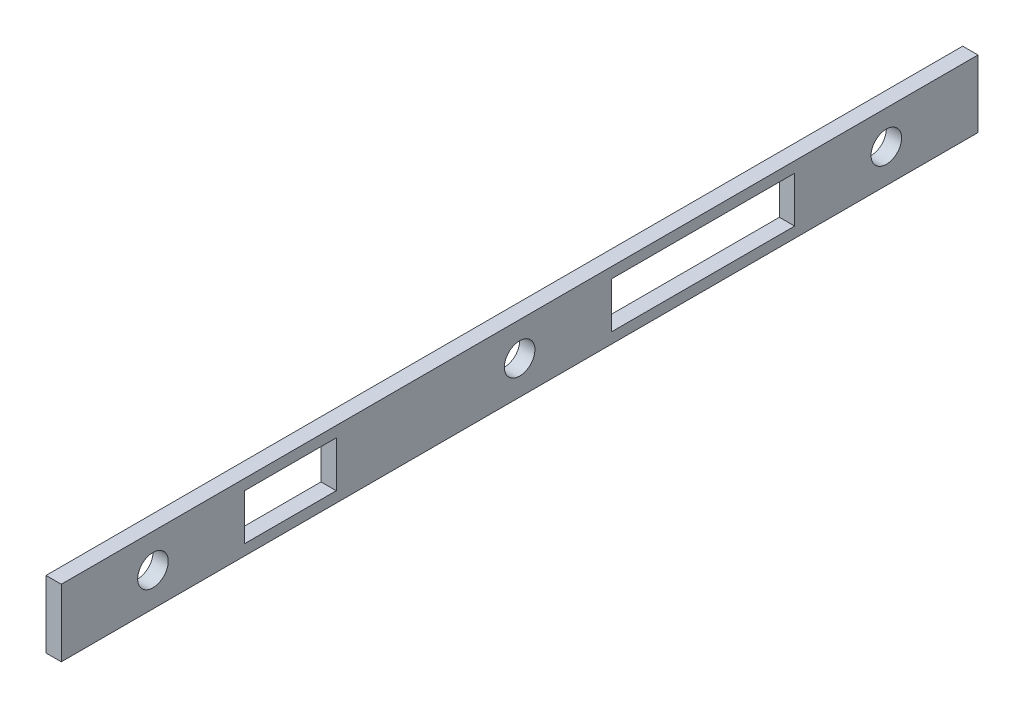
ISO-10303-21;
HEADER;
FILE_DESCRIPTION(('STEP AP214'),'2;1');
FILE_NAME('part.step','',(''),(''),'','','');
FILE_SCHEMA(('AUTOMOTIVE_DESIGN { 1 0 10303 214 1 1 1 1 }'));
ENDSEC;
DATA;
#1=APPLICATION_CONTEXT('core data for automotive mechanical design processes');
#2=APPLICATION_PROTOCOL_DEFINITION('international standard','automotive_design',2000,#1);
#3=PRODUCT_CONTEXT('',#1,'mechanical');
#4=PRODUCT('Part','Part','',(#3));
#5=PRODUCT_RELATED_PRODUCT_CATEGORY('part','',(#4));
#6=PRODUCT_DEFINITION_FORMATION('','',#4);
#7=PRODUCT_DEFINITION_CONTEXT('part definition',#1,'design');
#8=PRODUCT_DEFINITION('design','',#6,#7);
#9=PRODUCT_DEFINITION_SHAPE('','',#8);
#10=(LENGTH_UNIT() NAMED_UNIT(*) SI_UNIT(.MILLI.,.METRE.));
#11=(NAMED_UNIT(*) PLANE_ANGLE_UNIT() SI_UNIT($,.RADIAN.));
#12=(NAMED_UNIT(*) SI_UNIT($,.STERADIAN.) SOLID_ANGLE_UNIT());
#13=UNCERTAINTY_MEASURE_WITH_UNIT(LENGTH_MEASURE(1.E-05),#10,'distance_accuracy_value','');
#14=(GEOMETRIC_REPRESENTATION_CONTEXT(3) GLOBAL_UNCERTAINTY_ASSIGNED_CONTEXT((#13)) GLOBAL_UNIT_ASSIGNED_CONTEXT((#10,
#11,#12)) REPRESENTATION_CONTEXT('',''));
#15=CARTESIAN_POINT('',(0.,0.,0.));
#16=DIRECTION('',(0.,0.,1.));
#17=DIRECTION('',(1.,0.,0.));
#18=AXIS2_PLACEMENT_3D('',#15,#16,#17);
#19=CARTESIAN_POINT('',(5.,0.,0.));
#20=DIRECTION('',(0.,0.,-1.));
#21=DIRECTION('',(-1.,0.,0.));
#22=AXIS2_PLACEMENT_3D('',#19,#20,#21);
#23=PLANE('',#22);
#24=DIRECTION('',(0.,-1.,0.));
#25=VECTOR('',#24,1.);
#26=CARTESIAN_POINT('',(0.,0.,0.));
#27=LINE('',#26,#25);
#28=CARTESIAN_POINT('',(0.,22.,0.));
#29=VERTEX_POINT('',#28);
#30=CARTESIAN_POINT('',(0.,0.,0.));
#31=VERTEX_POINT('',#30);
#32=EDGE_CURVE('E255',#29,#31,#27,.T.);
#33=ORIENTED_EDGE('',*,*,#32,.T.);
#34=DIRECTION('',(-1.,0.,0.));
#35=VECTOR('',#34,1.);
#36=CARTESIAN_POINT('',(5.,0.,0.));
#37=LINE('',#36,#35);
#38=CARTESIAN_POINT('',(5.,0.,0.));
#39=VERTEX_POINT('',#38);
#40=EDGE_CURVE('E11',#39,#31,#37,.T.);
#41=ORIENTED_EDGE('',*,*,#40,.F.);
#42=DIRECTION('',(0.,-1.,0.));
#43=VECTOR('',#42,1.);
#44=CARTESIAN_POINT('',(5.,0.,0.));
#45=LINE('',#44,#43);
#46=CARTESIAN_POINT('',(5.,22.,0.));
#47=VERTEX_POINT('',#46);
#48=EDGE_CURVE('E240',#47,#39,#45,.T.);
#49=ORIENTED_EDGE('',*,*,#48,.F.);
#50=DIRECTION('',(-1.,0.,0.));
#51=VECTOR('',#50,1.);
#52=CARTESIAN_POINT('',(5.,22.,0.));
#53=LINE('',#52,#51);
#54=EDGE_CURVE('E254',#47,#29,#53,.T.);
#55=ORIENTED_EDGE('',*,*,#54,.T.);
#56=EDGE_LOOP('',(#33,#41,#49,#55));
#57=FACE_BOUND('',#56,.T.);
#58=ADVANCED_FACE('F39',(#57),#23,.F.);
#59=CARTESIAN_POINT('',(5.,0.,0.));
#60=DIRECTION('',(0.,1.,0.));
#61=DIRECTION('',(0.,0.,1.));
#62=AXIS2_PLACEMENT_3D('',#59,#60,#61);
#63=PLANE('',#62);
#64=DIRECTION('',(0.,0.,-1.));
#65=VECTOR('',#64,1.);
#66=CARTESIAN_POINT('',(0.,0.,0.));
#67=LINE('',#66,#65);
#68=CARTESIAN_POINT('',(0.,0.,-300.));
#69=VERTEX_POINT('',#68);
#70=EDGE_CURVE('E259',#31,#69,#67,.T.);
#71=ORIENTED_EDGE('',*,*,#70,.T.);
#72=DIRECTION('',(-1.,0.,0.));
#73=VECTOR('',#72,1.);
#74=CARTESIAN_POINT('',(5.,0.,-300.));
#75=LINE('',#74,#73);
#76=CARTESIAN_POINT('',(5.,0.,-300.));
#77=VERTEX_POINT('',#76);
#78=EDGE_CURVE('E47',#77,#69,#75,.T.);
#79=ORIENTED_EDGE('',*,*,#78,.F.);
#80=DIRECTION('',(0.,0.,-1.));
#81=VECTOR('',#80,1.);
#82=CARTESIAN_POINT('',(5.,0.,0.));
#83=LINE('',#82,#81);
#84=EDGE_CURVE('E244',#39,#77,#83,.T.);
#85=ORIENTED_EDGE('',*,*,#84,.F.);
#86=ORIENTED_EDGE('',*,*,#40,.T.);
#87=EDGE_LOOP('',(#71,#79,#85,#86));
#88=FACE_BOUND('',#87,.T.);
#89=ADVANCED_FACE('F295',(#88),#63,.F.);
#90=CARTESIAN_POINT('',(5.,0.,-300.));
#91=DIRECTION('',(0.,0.,1.));
#92=DIRECTION('',(1.,0.,0.));
#93=AXIS2_PLACEMENT_3D('',#90,#91,#92);
#94=PLANE('',#93);
#95=DIRECTION('',(0.,1.,0.));
#96=VECTOR('',#95,1.);
#97=CARTESIAN_POINT('',(0.,0.,-300.));
#98=LINE('',#97,#96);
#99=CARTESIAN_POINT('',(0.,22.,-300.));
#100=VERTEX_POINT('',#99);
#101=EDGE_CURVE('E263',#69,#100,#98,.T.);
#102=ORIENTED_EDGE('',*,*,#101,.T.);
#103=DIRECTION('',(-1.,0.,0.));
#104=VECTOR('',#103,1.);
#105=CARTESIAN_POINT('',(5.,22.,-300.));
#106=LINE('',#105,#104);
#107=CARTESIAN_POINT('',(5.,22.,-300.));
#108=VERTEX_POINT('',#107);
#109=EDGE_CURVE('E271',#108,#100,#106,.T.);
#110=ORIENTED_EDGE('',*,*,#109,.F.);
#111=DIRECTION('',(0.,1.,0.));
#112=VECTOR('',#111,1.);
#113=CARTESIAN_POINT('',(5.,0.,-300.));
#114=LINE('',#113,#112);
#115=EDGE_CURVE('E248',#77,#108,#114,.T.);
#116=ORIENTED_EDGE('',*,*,#115,.F.);
#117=ORIENTED_EDGE('',*,*,#78,.T.);
#118=EDGE_LOOP('',(#102,#110,#116,#117));
#119=FACE_BOUND('',#118,.T.);
#120=ADVANCED_FACE('F280',(#119),#94,.F.);
#121=CARTESIAN_POINT('',(5.,22.,0.));
#122=DIRECTION('',(0.,-1.,0.));
#123=DIRECTION('',(0.,0.,-1.));
#124=AXIS2_PLACEMENT_3D('',#121,#122,#123);
#125=PLANE('',#124);
#126=DIRECTION('',(0.,0.,1.));
#127=VECTOR('',#126,1.);
#128=CARTESIAN_POINT('',(0.,22.,0.));
#129=LINE('',#128,#127);
#130=EDGE_CURVE('E245',#100,#29,#129,.T.);
#131=ORIENTED_EDGE('',*,*,#130,.T.);
#132=ORIENTED_EDGE('',*,*,#54,.F.);
#133=DIRECTION('',(0.,0.,1.));
#134=VECTOR('',#133,1.);
#135=CARTESIAN_POINT('',(5.,22.,0.));
#136=LINE('',#135,#134);
#137=EDGE_CURVE('E251',#108,#47,#136,.T.);
#138=ORIENTED_EDGE('',*,*,#137,.F.);
#139=ORIENTED_EDGE('',*,*,#109,.T.);
#140=EDGE_LOOP('',(#131,#132,#138,#139));
#141=FACE_BOUND('',#140,.T.);
#142=ADVANCED_FACE('F288',(#141),#125,.F.);
#143=CARTESIAN_POINT('',(5.,0.,0.));
#144=DIRECTION('',(-1.,0.,0.));
#145=DIRECTION('',(0.,0.,1.));
#146=AXIS2_PLACEMENT_3D('',#143,#144,#145);
#147=PLANE('',#146);
#148=CARTESIAN_POINT('',(5.,11.,-30.));
#149=DIRECTION('',(1.,0.,0.));
#150=DIRECTION('',(0.,0.,-1.));
#151=AXIS2_PLACEMENT_3D('',#148,#149,#150);
#152=CIRCLE('',#151,5.);
#153=CARTESIAN_POINT('',(5.,11.,-35.));
#154=VERTEX_POINT('',#153);
#155=EDGE_CURVE('E159',#154,#154,#152,.T.);
#156=ORIENTED_EDGE('',*,*,#155,.F.);
#157=EDGE_LOOP('',(#156));
#158=FACE_BOUND('',#157,.T.);
#159=DIRECTION('',(0.,0.,-1.));
#160=VECTOR('',#159,1.);
#161=CARTESIAN_POINT('',(5.,3.5,-180.));
#162=LINE('',#161,#160);
#163=CARTESIAN_POINT('',(5.,3.5,-180.));
#164=VERTEX_POINT('',#163);
#165=CARTESIAN_POINT('',(5.,3.5,-240.));
#166=VERTEX_POINT('',#165);
#167=EDGE_CURVE('E204',#164,#166,#162,.T.);
#168=ORIENTED_EDGE('',*,*,#167,.F.);
#169=DIRECTION('',(0.,-1.,0.));
#170=VECTOR('',#169,1.);
#171=CARTESIAN_POINT('',(5.,18.5,-180.));
#172=LINE('',#171,#170);
#173=CARTESIAN_POINT('',(5.,18.5,-180.));
#174=VERTEX_POINT('',#173);
#175=EDGE_CURVE('E54',#174,#164,#172,.T.);
#176=ORIENTED_EDGE('',*,*,#175,.F.);
#177=DIRECTION('',(0.,0.,1.));
#178=VECTOR('',#177,1.);
#179=CARTESIAN_POINT('',(5.,18.5,-180.));
#180=LINE('',#179,#178);
#181=CARTESIAN_POINT('',(5.,18.5,-240.));
#182=VERTEX_POINT('',#181);
#183=EDGE_CURVE('E189',#182,#174,#180,.T.);
#184=ORIENTED_EDGE('',*,*,#183,.F.);
#185=DIRECTION('',(0.,1.,0.));
#186=VECTOR('',#185,1.);
#187=CARTESIAN_POINT('',(5.,18.5,-240.));
#188=LINE('',#187,#186);
#189=EDGE_CURVE('E208',#166,#182,#188,.T.);
#190=ORIENTED_EDGE('',*,*,#189,.F.);
#191=EDGE_LOOP('',(#168,#176,#184,#190));
#192=FACE_BOUND('',#191,.T.);
#193=DIRECTION('',(0.,0.,-1.));
#194=VECTOR('',#193,1.);
#195=CARTESIAN_POINT('',(5.,3.5,-60.));
#196=LINE('',#195,#194);
#197=CARTESIAN_POINT('',(5.,3.5,-60.));
#198=VERTEX_POINT('',#197);
#199=CARTESIAN_POINT('',(5.,3.5,-90.));
#200=VERTEX_POINT('',#199);
#201=EDGE_CURVE('E168',#198,#200,#196,.T.);
#202=ORIENTED_EDGE('',*,*,#201,.F.);
#203=DIRECTION('',(0.,-1.,0.));
#204=VECTOR('',#203,1.);
#205=CARTESIAN_POINT('',(5.,18.5,-60.));
#206=LINE('',#205,#204);
#207=CARTESIAN_POINT('',(5.,18.5,-60.));
#208=VERTEX_POINT('',#207);
#209=EDGE_CURVE('E62',#208,#198,#206,.T.);
#210=ORIENTED_EDGE('',*,*,#209,.F.);
#211=DIRECTION('',(0.,0.,1.));
#212=VECTOR('',#211,1.);
#213=CARTESIAN_POINT('',(5.,18.5,-60.));
#214=LINE('',#213,#212);
#215=CARTESIAN_POINT('',(5.,18.5,-90.));
#216=VERTEX_POINT('',#215);
#217=EDGE_CURVE('E152',#216,#208,#214,.T.);
#218=ORIENTED_EDGE('',*,*,#217,.F.);
#219=DIRECTION('',(0.,1.,0.));
#220=VECTOR('',#219,1.);
#221=CARTESIAN_POINT('',(5.,18.5,-90.));
#222=LINE('',#221,#220);
#223=EDGE_CURVE('E156',#200,#216,#222,.T.);
#224=ORIENTED_EDGE('',*,*,#223,.F.);
#225=EDGE_LOOP('',(#202,#210,#218,#224));
#226=FACE_BOUND('',#225,.T.);
#227=CARTESIAN_POINT('',(5.,11.,-270.));
#228=DIRECTION('',(1.,0.,0.));
#229=DIRECTION('',(0.,0.,-1.));
#230=AXIS2_PLACEMENT_3D('',#227,#228,#229);
#231=CIRCLE('',#230,4.99999999999999);
#232=CARTESIAN_POINT('',(5.,11.,-275.));
#233=VERTEX_POINT('',#232);
#234=EDGE_CURVE('E178',#233,#233,#231,.T.);
#235=ORIENTED_EDGE('',*,*,#234,.F.);
#236=EDGE_LOOP('',(#235));
#237=FACE_BOUND('',#236,.T.);
#238=CARTESIAN_POINT('',(5.,11.,-150.));
#239=DIRECTION('',(1.,0.,0.));
#240=DIRECTION('',(0.,0.,-1.));
#241=AXIS2_PLACEMENT_3D('',#238,#239,#240);
#242=CIRCLE('',#241,4.99999999999999);
#243=CARTESIAN_POINT('',(5.,11.,-155.));
#244=VERTEX_POINT('',#243);
#245=EDGE_CURVE('E229',#244,#244,#242,.T.);
#246=ORIENTED_EDGE('',*,*,#245,.F.);
#247=EDGE_LOOP('',(#246));
#248=FACE_BOUND('',#247,.T.);
#249=ORIENTED_EDGE('',*,*,#48,.T.);
#250=ORIENTED_EDGE('',*,*,#84,.T.);
#251=ORIENTED_EDGE('',*,*,#115,.T.);
#252=ORIENTED_EDGE('',*,*,#137,.T.);
#253=EDGE_LOOP('',(#249,#250,#251,#252));
#254=FACE_BOUND('',#253,.T.);
#255=ADVANCED_FACE('F294',(#158,#192,#226,#237,#248,#254),#147,.F.);
#256=CARTESIAN_POINT('',(0.,0.,0.));
#257=DIRECTION('',(-1.,0.,0.));
#258=DIRECTION('',(0.,0.,1.));
#259=AXIS2_PLACEMENT_3D('',#256,#257,#258);
#260=PLANE('',#259);
#261=CARTESIAN_POINT('',(0.,11.,-30.));
#262=DIRECTION('',(1.,0.,0.));
#263=DIRECTION('',(0.,0.,-1.));
#264=AXIS2_PLACEMENT_3D('',#261,#262,#263);
#265=CIRCLE('',#264,5.);
#266=CARTESIAN_POINT('',(0.,11.,-35.));
#267=VERTEX_POINT('',#266);
#268=EDGE_CURVE('E260',#267,#267,#265,.T.);
#269=ORIENTED_EDGE('',*,*,#268,.T.);
#270=EDGE_LOOP('',(#269));
#271=FACE_BOUND('',#270,.T.);
#272=DIRECTION('',(0.,-1.,0.));
#273=VECTOR('',#272,1.);
#274=CARTESIAN_POINT('',(0.,18.5,-180.));
#275=LINE('',#274,#273);
#276=CARTESIAN_POINT('',(0.,18.5,-180.));
#277=VERTEX_POINT('',#276);
#278=CARTESIAN_POINT('',(0.,3.5,-180.));
#279=VERTEX_POINT('',#278);
#280=EDGE_CURVE('E184',#277,#279,#275,.T.);
#281=ORIENTED_EDGE('',*,*,#280,.T.);
#282=DIRECTION('',(0.,0.,-1.));
#283=VECTOR('',#282,1.);
#284=CARTESIAN_POINT('',(0.,3.5,-180.));
#285=LINE('',#284,#283);
#286=CARTESIAN_POINT('',(0.,3.5,-240.));
#287=VERTEX_POINT('',#286);
#288=EDGE_CURVE('E188',#279,#287,#285,.T.);
#289=ORIENTED_EDGE('',*,*,#288,.T.);
#290=DIRECTION('',(0.,1.,0.));
#291=VECTOR('',#290,1.);
#292=CARTESIAN_POINT('',(0.,18.5,-240.));
#293=LINE('',#292,#291);
#294=CARTESIAN_POINT('',(0.,18.5,-240.));
#295=VERTEX_POINT('',#294);
#296=EDGE_CURVE('E193',#287,#295,#293,.T.);
#297=ORIENTED_EDGE('',*,*,#296,.T.);
#298=DIRECTION('',(0.,0.,1.));
#299=VECTOR('',#298,1.);
#300=CARTESIAN_POINT('',(0.,18.5,-180.));
#301=LINE('',#300,#299);
#302=EDGE_CURVE('E197',#295,#277,#301,.T.);
#303=ORIENTED_EDGE('',*,*,#302,.T.);
#304=EDGE_LOOP('',(#281,#289,#297,#303));
#305=FACE_BOUND('',#304,.T.);
#306=DIRECTION('',(0.,-1.,0.));
#307=VECTOR('',#306,1.);
#308=CARTESIAN_POINT('',(0.,18.5,-60.));
#309=LINE('',#308,#307);
#310=CARTESIAN_POINT('',(0.,18.5,-60.));
#311=VERTEX_POINT('',#310);
#312=CARTESIAN_POINT('',(0.,3.5,-60.));
#313=VERTEX_POINT('',#312);
#314=EDGE_CURVE('E130',#311,#313,#309,.T.);
#315=ORIENTED_EDGE('',*,*,#314,.T.);
#316=DIRECTION('',(0.,0.,-1.));
#317=VECTOR('',#316,1.);
#318=CARTESIAN_POINT('',(0.,3.5,-60.));
#319=LINE('',#318,#317);
#320=CARTESIAN_POINT('',(0.,3.5,-90.));
#321=VERTEX_POINT('',#320);
#322=EDGE_CURVE('E141',#313,#321,#319,.T.);
#323=ORIENTED_EDGE('',*,*,#322,.T.);
#324=DIRECTION('',(0.,1.,0.));
#325=VECTOR('',#324,1.);
#326=CARTESIAN_POINT('',(0.,18.5,-90.));
#327=LINE('',#326,#325);
#328=CARTESIAN_POINT('',(0.,18.5,-90.));
#329=VERTEX_POINT('',#328);
#330=EDGE_CURVE('E146',#321,#329,#327,.T.);
#331=ORIENTED_EDGE('',*,*,#330,.T.);
#332=DIRECTION('',(0.,0.,1.));
#333=VECTOR('',#332,1.);
#334=CARTESIAN_POINT('',(0.,18.5,-60.));
#335=LINE('',#334,#333);
#336=EDGE_CURVE('E137',#329,#311,#335,.T.);
#337=ORIENTED_EDGE('',*,*,#336,.T.);
#338=EDGE_LOOP('',(#315,#323,#331,#337));
#339=FACE_BOUND('',#338,.T.);
#340=CARTESIAN_POINT('',(0.,11.,-270.));
#341=DIRECTION('',(1.,0.,0.));
#342=DIRECTION('',(0.,0.,-1.));
#343=AXIS2_PLACEMENT_3D('',#340,#341,#342);
#344=CIRCLE('',#343,4.99999999999999);
#345=CARTESIAN_POINT('',(0.,11.,-275.));
#346=VERTEX_POINT('',#345);
#347=EDGE_CURVE('E233',#346,#346,#344,.T.);
#348=ORIENTED_EDGE('',*,*,#347,.T.);
#349=EDGE_LOOP('',(#348));
#350=FACE_BOUND('',#349,.T.);
#351=CARTESIAN_POINT('',(0.,11.,-150.));
#352=DIRECTION('',(1.,0.,0.));
#353=DIRECTION('',(0.,0.,-1.));
#354=AXIS2_PLACEMENT_3D('',#351,#352,#353);
#355=CIRCLE('',#354,4.99999999999999);
#356=CARTESIAN_POINT('',(0.,11.,-155.));
#357=VERTEX_POINT('',#356);
#358=EDGE_CURVE('E225',#357,#357,#355,.T.);
#359=ORIENTED_EDGE('',*,*,#358,.T.);
#360=EDGE_LOOP('',(#359));
#361=FACE_BOUND('',#360,.T.);
#362=ORIENTED_EDGE('',*,*,#32,.F.);
#363=ORIENTED_EDGE('',*,*,#130,.F.);
#364=ORIENTED_EDGE('',*,*,#101,.F.);
#365=ORIENTED_EDGE('',*,*,#70,.F.);
#366=EDGE_LOOP('',(#362,#363,#364,#365));
#367=FACE_BOUND('',#366,.T.);
#368=ADVANCED_FACE('F148',(#271,#305,#339,#350,#361,#367),#260,.T.);
#369=CARTESIAN_POINT('',(0.,11.,-150.));
#370=DIRECTION('',(1.,0.,0.));
#371=DIRECTION('',(0.,0.,-1.));
#372=AXIS2_PLACEMENT_3D('',#369,#370,#371);
#373=CYLINDRICAL_SURFACE('',#372,4.99999999999999);
#374=ORIENTED_EDGE('',*,*,#358,.F.);
#375=EDGE_LOOP('',(#374));
#376=FACE_BOUND('',#375,.T.);
#377=ORIENTED_EDGE('',*,*,#245,.T.);
#378=EDGE_LOOP('',(#377));
#379=FACE_BOUND('',#378,.T.);
#380=ADVANCED_FACE('F307',(#376,#379),#373,.F.);
#381=CARTESIAN_POINT('',(0.,11.,-270.));
#382=DIRECTION('',(1.,0.,0.));
#383=DIRECTION('',(0.,0.,-1.));
#384=AXIS2_PLACEMENT_3D('',#381,#382,#383);
#385=CYLINDRICAL_SURFACE('',#384,4.99999999999999);
#386=ORIENTED_EDGE('',*,*,#347,.F.);
#387=EDGE_LOOP('',(#386));
#388=FACE_BOUND('',#387,.T.);
#389=ORIENTED_EDGE('',*,*,#234,.T.);
#390=EDGE_LOOP('',(#389));
#391=FACE_BOUND('',#390,.T.);
#392=ADVANCED_FACE('F312',(#388,#391),#385,.F.);
#393=CARTESIAN_POINT('',(0.,18.5,-60.));
#394=DIRECTION('',(0.,0.,1.));
#395=DIRECTION('',(1.,0.,0.));
#396=AXIS2_PLACEMENT_3D('',#393,#394,#395);
#397=PLANE('',#396);
#398=ORIENTED_EDGE('',*,*,#209,.T.);
#399=DIRECTION('',(1.,0.,0.));
#400=VECTOR('',#399,1.);
#401=CARTESIAN_POINT('',(0.,3.5,-60.));
#402=LINE('',#401,#400);
#403=EDGE_CURVE('E126',#313,#198,#402,.T.);
#404=ORIENTED_EDGE('',*,*,#403,.F.);
#405=ORIENTED_EDGE('',*,*,#314,.F.);
#406=DIRECTION('',(1.,0.,0.));
#407=VECTOR('',#406,1.);
#408=CARTESIAN_POINT('',(0.,18.5,-60.));
#409=LINE('',#408,#407);
#410=EDGE_CURVE('E175',#311,#208,#409,.T.);
#411=ORIENTED_EDGE('',*,*,#410,.T.);
#412=EDGE_LOOP('',(#398,#404,#405,#411));
#413=FACE_BOUND('',#412,.T.);
#414=ADVANCED_FACE('F128',(#413),#397,.F.);
#415=CARTESIAN_POINT('',(0.,18.5,-60.));
#416=DIRECTION('',(0.,1.,0.));
#417=DIRECTION('',(0.,0.,1.));
#418=AXIS2_PLACEMENT_3D('',#415,#416,#417);
#419=PLANE('',#418);
#420=ORIENTED_EDGE('',*,*,#217,.T.);
#421=ORIENTED_EDGE('',*,*,#410,.F.);
#422=ORIENTED_EDGE('',*,*,#336,.F.);
#423=DIRECTION('',(1.,0.,0.));
#424=VECTOR('',#423,1.);
#425=CARTESIAN_POINT('',(0.,18.5,-90.));
#426=LINE('',#425,#424);
#427=EDGE_CURVE('E179',#329,#216,#426,.T.);
#428=ORIENTED_EDGE('',*,*,#427,.T.);
#429=EDGE_LOOP('',(#420,#421,#422,#428));
#430=FACE_BOUND('',#429,.T.);
#431=ADVANCED_FACE('F337',(#430),#419,.F.);
#432=CARTESIAN_POINT('',(0.,18.5,-90.));
#433=DIRECTION('',(0.,0.,-1.));
#434=DIRECTION('',(-1.,0.,0.));
#435=AXIS2_PLACEMENT_3D('',#432,#433,#434);
#436=PLANE('',#435);
#437=ORIENTED_EDGE('',*,*,#223,.T.);
#438=ORIENTED_EDGE('',*,*,#427,.F.);
#439=ORIENTED_EDGE('',*,*,#330,.F.);
#440=DIRECTION('',(1.,0.,0.));
#441=VECTOR('',#440,1.);
#442=CARTESIAN_POINT('',(0.,3.5,-90.));
#443=LINE('',#442,#441);
#444=EDGE_CURVE('E136',#321,#200,#443,.T.);
#445=ORIENTED_EDGE('',*,*,#444,.T.);
#446=EDGE_LOOP('',(#437,#438,#439,#445));
#447=FACE_BOUND('',#446,.T.);
#448=ADVANCED_FACE('F340',(#447),#436,.F.);
#449=CARTESIAN_POINT('',(0.,3.5,-60.));
#450=DIRECTION('',(0.,-1.,0.));
#451=DIRECTION('',(0.,0.,-1.));
#452=AXIS2_PLACEMENT_3D('',#449,#450,#451);
#453=PLANE('',#452);
#454=ORIENTED_EDGE('',*,*,#201,.T.);
#455=ORIENTED_EDGE('',*,*,#444,.F.);
#456=ORIENTED_EDGE('',*,*,#322,.F.);
#457=ORIENTED_EDGE('',*,*,#403,.T.);
#458=EDGE_LOOP('',(#454,#455,#456,#457));
#459=FACE_BOUND('',#458,.T.);
#460=ADVANCED_FACE('F142',(#459),#453,.F.);
#461=CARTESIAN_POINT('',(0.,18.5,-180.));
#462=DIRECTION('',(0.,0.,1.));
#463=DIRECTION('',(1.,0.,0.));
#464=AXIS2_PLACEMENT_3D('',#461,#462,#463);
#465=PLANE('',#464);
#466=ORIENTED_EDGE('',*,*,#175,.T.);
#467=DIRECTION('',(1.,0.,0.));
#468=VECTOR('',#467,1.);
#469=CARTESIAN_POINT('',(0.,3.5,-180.));
#470=LINE('',#469,#468);
#471=EDGE_CURVE('E201',#279,#164,#470,.T.);
#472=ORIENTED_EDGE('',*,*,#471,.F.);
#473=ORIENTED_EDGE('',*,*,#280,.F.);
#474=DIRECTION('',(1.,0.,0.));
#475=VECTOR('',#474,1.);
#476=CARTESIAN_POINT('',(0.,18.5,-180.));
#477=LINE('',#476,#475);
#478=EDGE_CURVE('E169',#277,#174,#477,.T.);
#479=ORIENTED_EDGE('',*,*,#478,.T.);
#480=EDGE_LOOP('',(#466,#472,#473,#479));
#481=FACE_BOUND('',#480,.T.);
#482=ADVANCED_FACE('F319',(#481),#465,.F.);
#483=CARTESIAN_POINT('',(0.,18.5,-180.));
#484=DIRECTION('',(0.,1.,0.));
#485=DIRECTION('',(0.,0.,1.));
#486=AXIS2_PLACEMENT_3D('',#483,#484,#485);
#487=PLANE('',#486);
#488=ORIENTED_EDGE('',*,*,#183,.T.);
#489=ORIENTED_EDGE('',*,*,#478,.F.);
#490=ORIENTED_EDGE('',*,*,#302,.F.);
#491=DIRECTION('',(1.,0.,0.));
#492=VECTOR('',#491,1.);
#493=CARTESIAN_POINT('',(0.,18.5,-240.));
#494=LINE('',#493,#492);
#495=EDGE_CURVE('E217',#295,#182,#494,.T.);
#496=ORIENTED_EDGE('',*,*,#495,.T.);
#497=EDGE_LOOP('',(#488,#489,#490,#496));
#498=FACE_BOUND('',#497,.T.);
#499=ADVANCED_FACE('F322',(#498),#487,.F.);
#500=CARTESIAN_POINT('',(0.,18.5,-240.));
#501=DIRECTION('',(0.,0.,-1.));
#502=DIRECTION('',(-1.,0.,0.));
#503=AXIS2_PLACEMENT_3D('',#500,#501,#502);
#504=PLANE('',#503);
#505=ORIENTED_EDGE('',*,*,#189,.T.);
#506=ORIENTED_EDGE('',*,*,#495,.F.);
#507=ORIENTED_EDGE('',*,*,#296,.F.);
#508=DIRECTION('',(1.,0.,0.));
#509=VECTOR('',#508,1.);
#510=CARTESIAN_POINT('',(0.,3.5,-240.));
#511=LINE('',#510,#509);
#512=EDGE_CURVE('E220',#287,#166,#511,.T.);
#513=ORIENTED_EDGE('',*,*,#512,.T.);
#514=EDGE_LOOP('',(#505,#506,#507,#513));
#515=FACE_BOUND('',#514,.T.);
#516=ADVANCED_FACE('F327',(#515),#504,.F.);
#517=CARTESIAN_POINT('',(0.,3.5,-180.));
#518=DIRECTION('',(0.,-1.,0.));
#519=DIRECTION('',(0.,0.,-1.));
#520=AXIS2_PLACEMENT_3D('',#517,#518,#519);
#521=PLANE('',#520);
#522=ORIENTED_EDGE('',*,*,#167,.T.);
#523=ORIENTED_EDGE('',*,*,#512,.F.);
#524=ORIENTED_EDGE('',*,*,#288,.F.);
#525=ORIENTED_EDGE('',*,*,#471,.T.);
#526=EDGE_LOOP('',(#522,#523,#524,#525));
#527=FACE_BOUND('',#526,.T.);
#528=ADVANCED_FACE('F323',(#527),#521,.F.);
#529=CARTESIAN_POINT('',(0.,11.,-30.));
#530=DIRECTION('',(1.,0.,0.));
#531=DIRECTION('',(0.,0.,-1.));
#532=AXIS2_PLACEMENT_3D('',#529,#530,#531);
#533=CYLINDRICAL_SURFACE('',#532,5.);
#534=ORIENTED_EDGE('',*,*,#268,.F.);
#535=EDGE_LOOP('',(#534));
#536=FACE_BOUND('',#535,.T.);
#537=ORIENTED_EDGE('',*,*,#155,.T.);
#538=EDGE_LOOP('',(#537));
#539=FACE_BOUND('',#538,.T.);
#540=ADVANCED_FACE('F326',(#536,#539),#533,.F.);
#541=CLOSED_SHELL('',(#58,#89,#120,#142,#255,#368,#380,#392,#414,#431,#448,#460,#482,#499,#516,
#528,#540));
#542=MANIFOLD_SOLID_BREP('B2',#541);
#543=ADVANCED_BREP_SHAPE_REPRESENTATION('',(#18,#542),#14);
#544=SHAPE_DEFINITION_REPRESENTATION(#9,#543);
ENDSEC;
END-ISO-10303-21;
